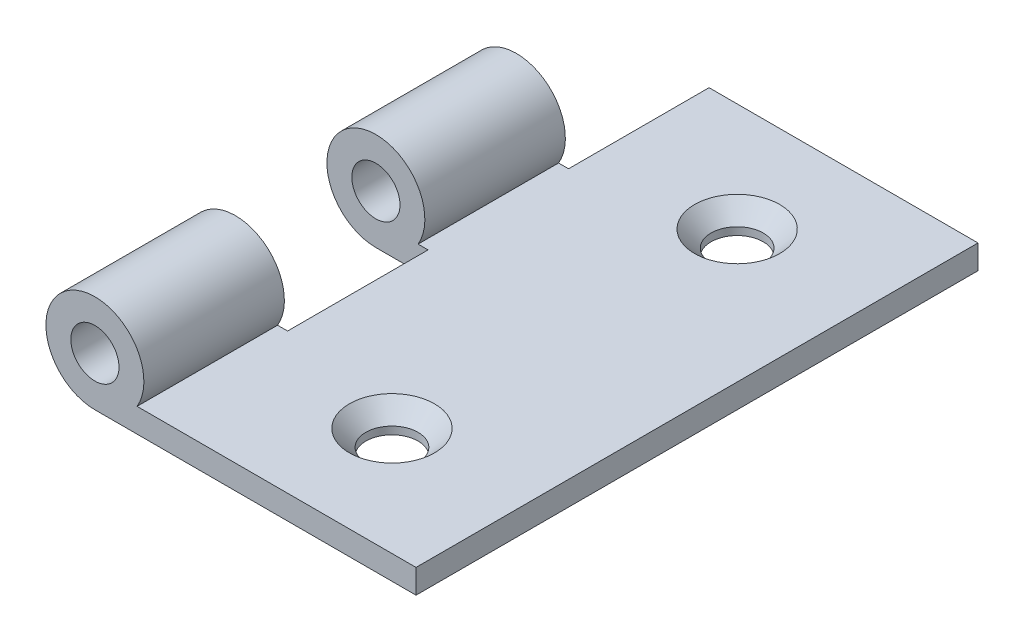
ISO-10303-21;
HEADER;
FILE_DESCRIPTION(('STEP AP214'),'2;1');
FILE_NAME('part.step','',(''),(''),'','','');
FILE_SCHEMA(('AUTOMOTIVE_DESIGN { 1 0 10303 214 1 1 1 1 }'));
ENDSEC;
DATA;
#1=APPLICATION_CONTEXT('core data for automotive mechanical design processes');
#2=APPLICATION_PROTOCOL_DEFINITION('international standard','automotive_design',2000,#1);
#3=PRODUCT_CONTEXT('',#1,'mechanical');
#4=PRODUCT('Part','Part','',(#3));
#5=PRODUCT_RELATED_PRODUCT_CATEGORY('part','',(#4));
#6=PRODUCT_DEFINITION_FORMATION('','',#4);
#7=PRODUCT_DEFINITION_CONTEXT('part definition',#1,'design');
#8=PRODUCT_DEFINITION('design','',#6,#7);
#9=PRODUCT_DEFINITION_SHAPE('','',#8);
#10=(LENGTH_UNIT() NAMED_UNIT(*) SI_UNIT(.MILLI.,.METRE.));
#11=(NAMED_UNIT(*) PLANE_ANGLE_UNIT() SI_UNIT($,.RADIAN.));
#12=(NAMED_UNIT(*) SI_UNIT($,.STERADIAN.) SOLID_ANGLE_UNIT());
#13=UNCERTAINTY_MEASURE_WITH_UNIT(LENGTH_MEASURE(1.E-05),#10,'distance_accuracy_value','');
#14=(GEOMETRIC_REPRESENTATION_CONTEXT(3) GLOBAL_UNCERTAINTY_ASSIGNED_CONTEXT((#13)) GLOBAL_UNIT_ASSIGNED_CONTEXT((#10,
#11,#12)) REPRESENTATION_CONTEXT('',''));
#15=CARTESIAN_POINT('',(0.,0.,0.));
#16=DIRECTION('',(0.,0.,1.));
#17=DIRECTION('',(1.,0.,0.));
#18=AXIS2_PLACEMENT_3D('',#15,#16,#17);
#19=CARTESIAN_POINT('',(40.,-3.1,70.));
#20=DIRECTION('',(0.,-1.,0.));
#21=DIRECTION('',(0.,0.,-1.));
#22=AXIS2_PLACEMENT_3D('',#19,#20,#21);
#23=PLANE('',#22);
#24=CARTESIAN_POINT('',(23.5,-3.1,13.5));
#25=DIRECTION('',(0.,-1.,0.));
#26=DIRECTION('',(0.,0.,-1.));
#27=AXIS2_PLACEMENT_3D('',#24,#25,#26);
#28=CIRCLE('',#27,5.3);
#29=CARTESIAN_POINT('',(23.5,-3.1,8.2));
#30=VERTEX_POINT('',#29);
#31=EDGE_CURVE('E11',#30,#30,#28,.T.);
#32=ORIENTED_EDGE('',*,*,#31,.T.);
#33=EDGE_LOOP('',(#32));
#34=FACE_BOUND('',#33,.T.);
#35=CARTESIAN_POINT('',(23.5,-3.1,56.5));
#36=DIRECTION('',(0.,-1.,0.));
#37=DIRECTION('',(0.,0.,-1.));
#38=AXIS2_PLACEMENT_3D('',#35,#36,#37);
#39=CIRCLE('',#38,5.3);
#40=CARTESIAN_POINT('',(23.5,-3.1,51.2));
#41=VERTEX_POINT('',#40);
#42=EDGE_CURVE('E28',#41,#41,#39,.T.);
#43=ORIENTED_EDGE('',*,*,#42,.T.);
#44=EDGE_LOOP('',(#43));
#45=FACE_BOUND('',#44,.T.);
#46=DIRECTION('',(1.,0.,0.));
#47=VECTOR('',#46,1.);
#48=CARTESIAN_POINT('',(40.,-3.1,52.5));
#49=LINE('',#48,#47);
#50=CARTESIAN_POINT('',(5.25357021462548,-3.1,52.5));
#51=VERTEX_POINT('',#50);
#52=CARTESIAN_POINT('',(6.5,-3.1,52.5));
#53=VERTEX_POINT('',#52);
#54=EDGE_CURVE('E119',#51,#53,#49,.T.);
#55=ORIENTED_EDGE('',*,*,#54,.F.);
#56=DIRECTION('',(0.,0.,-1.));
#57=VECTOR('',#56,1.);
#58=CARTESIAN_POINT('',(5.25357021462548,-3.1,70.));
#59=LINE('',#58,#57);
#60=CARTESIAN_POINT('',(5.25357021462548,-3.1,70.));
#61=VERTEX_POINT('',#60);
#62=EDGE_CURVE('E227',#61,#51,#59,.T.);
#63=ORIENTED_EDGE('',*,*,#62,.F.);
#64=DIRECTION('',(-1.,0.,0.));
#65=VECTOR('',#64,1.);
#66=CARTESIAN_POINT('',(40.,-3.1,70.));
#67=LINE('',#66,#65);
#68=CARTESIAN_POINT('',(40.,-3.1,70.));
#69=VERTEX_POINT('',#68);
#70=EDGE_CURVE('E174',#69,#61,#67,.T.);
#71=ORIENTED_EDGE('',*,*,#70,.F.);
#72=DIRECTION('',(0.,0.,-1.));
#73=VECTOR('',#72,1.);
#74=CARTESIAN_POINT('',(40.,-3.1,70.));
#75=LINE('',#74,#73);
#76=CARTESIAN_POINT('',(40.,-3.1,0.));
#77=VERTEX_POINT('',#76);
#78=EDGE_CURVE('E263',#69,#77,#75,.T.);
#79=ORIENTED_EDGE('',*,*,#78,.T.);
#80=DIRECTION('',(-1.,0.,0.));
#81=VECTOR('',#80,1.);
#82=CARTESIAN_POINT('',(40.,-3.1,0.));
#83=LINE('',#82,#81);
#84=CARTESIAN_POINT('',(6.5,-3.1,0.));
#85=VERTEX_POINT('',#84);
#86=EDGE_CURVE('E229',#77,#85,#83,.T.);
#87=ORIENTED_EDGE('',*,*,#86,.T.);
#88=DIRECTION('',(0.,0.,-1.));
#89=VECTOR('',#88,1.);
#90=CARTESIAN_POINT('',(6.5,-3.1,70.));
#91=LINE('',#90,#89);
#92=CARTESIAN_POINT('',(6.5,-3.1,17.5));
#93=VERTEX_POINT('',#92);
#94=EDGE_CURVE('E199',#93,#85,#91,.T.);
#95=ORIENTED_EDGE('',*,*,#94,.F.);
#96=DIRECTION('',(1.,0.,0.));
#97=VECTOR('',#96,1.);
#98=CARTESIAN_POINT('',(40.,-3.1,17.5));
#99=LINE('',#98,#97);
#100=CARTESIAN_POINT('',(5.25357021462548,-3.1,17.5));
#101=VERTEX_POINT('',#100);
#102=EDGE_CURVE('E205',#101,#93,#99,.T.);
#103=ORIENTED_EDGE('',*,*,#102,.F.);
#104=DIRECTION('',(0.,0.,-1.));
#105=VECTOR('',#104,1.);
#106=CARTESIAN_POINT('',(5.25357021462548,-3.1,70.));
#107=LINE('',#106,#105);
#108=CARTESIAN_POINT('',(5.25357021462548,-3.1,35.));
#109=VERTEX_POINT('',#108);
#110=EDGE_CURVE('E230',#109,#101,#107,.T.);
#111=ORIENTED_EDGE('',*,*,#110,.F.);
#112=DIRECTION('',(-1.,0.,0.));
#113=VECTOR('',#112,1.);
#114=CARTESIAN_POINT('',(40.,-3.1,35.));
#115=LINE('',#114,#113);
#116=CARTESIAN_POINT('',(6.5,-3.1,35.));
#117=VERTEX_POINT('',#116);
#118=EDGE_CURVE('E130',#117,#109,#115,.T.);
#119=ORIENTED_EDGE('',*,*,#118,.F.);
#120=DIRECTION('',(0.,0.,-1.));
#121=VECTOR('',#120,1.);
#122=CARTESIAN_POINT('',(6.5,-3.1,70.));
#123=LINE('',#122,#121);
#124=EDGE_CURVE('E242',#53,#117,#123,.T.);
#125=ORIENTED_EDGE('',*,*,#124,.F.);
#126=EDGE_LOOP('',(#55,#63,#71,#79,#87,#95,#103,#111,#119,#125));
#127=FACE_BOUND('',#126,.T.);
#128=ADVANCED_FACE('F17',(#34,#45,#127),#23,.F.);
#129=CARTESIAN_POINT('',(0.,0.,70.));
#130=DIRECTION('',(0.,0.,-1.));
#131=DIRECTION('',(-1.,0.,0.));
#132=AXIS2_PLACEMENT_3D('',#129,#130,#131);
#133=CYLINDRICAL_SURFACE('',#132,6.1);
#134=CARTESIAN_POINT('',(0.,0.,52.5));
#135=DIRECTION('',(0.,0.,-1.));
#136=DIRECTION('',(-1.,0.,0.));
#137=AXIS2_PLACEMENT_3D('',#134,#135,#136);
#138=CIRCLE('',#137,6.1);
#139=CARTESIAN_POINT('',(0.,-6.1,52.5));
#140=VERTEX_POINT('',#139);
#141=EDGE_CURVE('E182',#140,#51,#138,.T.);
#142=ORIENTED_EDGE('',*,*,#141,.F.);
#143=DIRECTION('',(0.,0.,-1.));
#144=VECTOR('',#143,1.);
#145=CARTESIAN_POINT('',(0.,-6.1,70.));
#146=LINE('',#145,#144);
#147=CARTESIAN_POINT('',(0.,-6.1,70.));
#148=VERTEX_POINT('',#147);
#149=EDGE_CURVE('E181',#148,#140,#146,.T.);
#150=ORIENTED_EDGE('',*,*,#149,.F.);
#151=CARTESIAN_POINT('',(0.,0.,70.));
#152=DIRECTION('',(0.,0.,1.));
#153=DIRECTION('',(1.,0.,0.));
#154=AXIS2_PLACEMENT_3D('',#151,#152,#153);
#155=CIRCLE('',#154,6.1);
#156=EDGE_CURVE('E166',#61,#148,#155,.T.);
#157=ORIENTED_EDGE('',*,*,#156,.F.);
#158=ORIENTED_EDGE('',*,*,#62,.T.);
#159=EDGE_LOOP('',(#142,#150,#157,#158));
#160=FACE_BOUND('',#159,.T.);
#161=ADVANCED_FACE('F19',(#160),#133,.T.);
#162=CARTESIAN_POINT('',(0.,0.,70.));
#163=DIRECTION('',(0.,0.,-1.));
#164=DIRECTION('',(-1.,0.,0.));
#165=AXIS2_PLACEMENT_3D('',#162,#163,#164);
#166=CYLINDRICAL_SURFACE('',#165,6.1);
#167=CARTESIAN_POINT('',(0.,0.,35.));
#168=DIRECTION('',(0.,0.,1.));
#169=DIRECTION('',(1.,0.,0.));
#170=AXIS2_PLACEMENT_3D('',#167,#168,#169);
#171=CIRCLE('',#170,6.1);
#172=CARTESIAN_POINT('',(0.,-6.1,35.));
#173=VERTEX_POINT('',#172);
#174=EDGE_CURVE('E277',#109,#173,#171,.T.);
#175=ORIENTED_EDGE('',*,*,#174,.F.);
#176=ORIENTED_EDGE('',*,*,#110,.T.);
#177=CARTESIAN_POINT('',(0.,0.,17.5));
#178=DIRECTION('',(0.,0.,-1.));
#179=DIRECTION('',(-1.,0.,0.));
#180=AXIS2_PLACEMENT_3D('',#177,#178,#179);
#181=CIRCLE('',#180,6.1);
#182=CARTESIAN_POINT('',(0.,-6.1,17.5));
#183=VERTEX_POINT('',#182);
#184=EDGE_CURVE('E292',#183,#101,#181,.T.);
#185=ORIENTED_EDGE('',*,*,#184,.F.);
#186=DIRECTION('',(0.,0.,-1.));
#187=VECTOR('',#186,1.);
#188=CARTESIAN_POINT('',(0.,-6.1,70.));
#189=LINE('',#188,#187);
#190=EDGE_CURVE('E266',#173,#183,#189,.T.);
#191=ORIENTED_EDGE('',*,*,#190,.F.);
#192=EDGE_LOOP('',(#175,#176,#185,#191));
#193=FACE_BOUND('',#192,.T.);
#194=ADVANCED_FACE('F355',(#193),#166,.T.);
#195=CARTESIAN_POINT('',(0.,-6.1,70.));
#196=DIRECTION('',(0.,1.,0.));
#197=DIRECTION('',(1.,0.,0.));
#198=AXIS2_PLACEMENT_3D('',#195,#196,#197);
#199=PLANE('',#198);
#200=CARTESIAN_POINT('',(23.5,-6.1,13.5));
#201=DIRECTION('',(0.,-1.,0.));
#202=DIRECTION('',(0.,0.,-1.));
#203=AXIS2_PLACEMENT_3D('',#200,#201,#202);
#204=CIRCLE('',#203,3.25);
#205=CARTESIAN_POINT('',(23.5,-6.1,10.25));
#206=VERTEX_POINT('',#205);
#207=EDGE_CURVE('E211',#206,#206,#204,.T.);
#208=ORIENTED_EDGE('',*,*,#207,.F.);
#209=EDGE_LOOP('',(#208));
#210=FACE_BOUND('',#209,.T.);
#211=CARTESIAN_POINT('',(23.5,-6.1,56.5));
#212=DIRECTION('',(0.,-1.,0.));
#213=DIRECTION('',(0.,0.,-1.));
#214=AXIS2_PLACEMENT_3D('',#211,#212,#213);
#215=CIRCLE('',#214,3.25);
#216=CARTESIAN_POINT('',(23.5,-6.1,53.25));
#217=VERTEX_POINT('',#216);
#218=EDGE_CURVE('E210',#217,#217,#215,.T.);
#219=ORIENTED_EDGE('',*,*,#218,.F.);
#220=EDGE_LOOP('',(#219));
#221=FACE_BOUND('',#220,.T.);
#222=DIRECTION('',(-1.,0.,0.));
#223=VECTOR('',#222,1.);
#224=CARTESIAN_POINT('',(0.,-6.1,52.5));
#225=LINE('',#224,#223);
#226=CARTESIAN_POINT('',(6.5,-6.1,52.5));
#227=VERTEX_POINT('',#226);
#228=EDGE_CURVE('E256',#227,#140,#225,.T.);
#229=ORIENTED_EDGE('',*,*,#228,.F.);
#230=DIRECTION('',(0.,0.,1.));
#231=VECTOR('',#230,1.);
#232=CARTESIAN_POINT('',(6.5,-6.1,70.));
#233=LINE('',#232,#231);
#234=CARTESIAN_POINT('',(6.5,-6.1,35.));
#235=VERTEX_POINT('',#234);
#236=EDGE_CURVE('E243',#235,#227,#233,.T.);
#237=ORIENTED_EDGE('',*,*,#236,.F.);
#238=DIRECTION('',(1.,0.,0.));
#239=VECTOR('',#238,1.);
#240=CARTESIAN_POINT('',(0.,-6.1,35.));
#241=LINE('',#240,#239);
#242=EDGE_CURVE('E288',#173,#235,#241,.T.);
#243=ORIENTED_EDGE('',*,*,#242,.F.);
#244=ORIENTED_EDGE('',*,*,#190,.T.);
#245=DIRECTION('',(-1.,0.,0.));
#246=VECTOR('',#245,1.);
#247=CARTESIAN_POINT('',(0.,-6.1,17.5));
#248=LINE('',#247,#246);
#249=CARTESIAN_POINT('',(6.5,-6.1,17.5));
#250=VERTEX_POINT('',#249);
#251=EDGE_CURVE('E206',#250,#183,#248,.T.);
#252=ORIENTED_EDGE('',*,*,#251,.F.);
#253=DIRECTION('',(0.,0.,1.));
#254=VECTOR('',#253,1.);
#255=CARTESIAN_POINT('',(6.5,-6.1,70.));
#256=LINE('',#255,#254);
#257=CARTESIAN_POINT('',(6.5,-6.1,0.));
#258=VERTEX_POINT('',#257);
#259=EDGE_CURVE('E259',#258,#250,#256,.T.);
#260=ORIENTED_EDGE('',*,*,#259,.F.);
#261=DIRECTION('',(1.,0.,0.));
#262=VECTOR('',#261,1.);
#263=CARTESIAN_POINT('',(0.,-6.1,0.));
#264=LINE('',#263,#262);
#265=CARTESIAN_POINT('',(40.,-6.1,0.));
#266=VERTEX_POINT('',#265);
#267=EDGE_CURVE('E186',#258,#266,#264,.T.);
#268=ORIENTED_EDGE('',*,*,#267,.T.);
#269=DIRECTION('',(0.,0.,-1.));
#270=VECTOR('',#269,1.);
#271=CARTESIAN_POINT('',(40.,-6.1,70.));
#272=LINE('',#271,#270);
#273=CARTESIAN_POINT('',(40.,-6.1,70.));
#274=VERTEX_POINT('',#273);
#275=EDGE_CURVE('E191',#274,#266,#272,.T.);
#276=ORIENTED_EDGE('',*,*,#275,.F.);
#277=DIRECTION('',(1.,0.,0.));
#278=VECTOR('',#277,1.);
#279=CARTESIAN_POINT('',(0.,-6.1,70.));
#280=LINE('',#279,#278);
#281=EDGE_CURVE('E171',#148,#274,#280,.T.);
#282=ORIENTED_EDGE('',*,*,#281,.F.);
#283=ORIENTED_EDGE('',*,*,#149,.T.);
#284=EDGE_LOOP('',(#229,#237,#243,#244,#252,#260,#268,#276,#282,#283));
#285=FACE_BOUND('',#284,.T.);
#286=ADVANCED_FACE('F189',(#210,#221,#285),#199,.F.);
#287=CARTESIAN_POINT('',(0.,0.,70.));
#288=DIRECTION('',(0.,0.,-1.));
#289=DIRECTION('',(-1.,0.,0.));
#290=AXIS2_PLACEMENT_3D('',#287,#288,#289);
#291=CYLINDRICAL_SURFACE('',#290,3.);
#292=CARTESIAN_POINT('',(0.,0.,70.));
#293=DIRECTION('',(0.,0.,1.));
#294=DIRECTION('',(1.,0.,0.));
#295=AXIS2_PLACEMENT_3D('',#292,#293,#294);
#296=CIRCLE('',#295,3.);
#297=CARTESIAN_POINT('',(3.,0.,70.));
#298=VERTEX_POINT('',#297);
#299=EDGE_CURVE('E187',#298,#298,#296,.T.);
#300=ORIENTED_EDGE('',*,*,#299,.T.);
#301=EDGE_LOOP('',(#300));
#302=FACE_BOUND('',#301,.T.);
#303=CARTESIAN_POINT('',(0.,0.,52.5));
#304=DIRECTION('',(0.,0.,-1.));
#305=DIRECTION('',(-1.,0.,0.));
#306=AXIS2_PLACEMENT_3D('',#303,#304,#305);
#307=CIRCLE('',#306,3.);
#308=CARTESIAN_POINT('',(-3.,0.,52.5));
#309=VERTEX_POINT('',#308);
#310=EDGE_CURVE('E231',#309,#309,#307,.T.);
#311=ORIENTED_EDGE('',*,*,#310,.T.);
#312=EDGE_LOOP('',(#311));
#313=FACE_BOUND('',#312,.T.);
#314=ADVANCED_FACE('F337',(#302,#313),#291,.F.);
#315=CARTESIAN_POINT('',(0.,0.,0.));
#316=DIRECTION('',(0.,0.,1.));
#317=DIRECTION('',(1.,0.,0.));
#318=AXIS2_PLACEMENT_3D('',#315,#316,#317);
#319=PLANE('',#318);
#320=DIRECTION('',(0.,-1.,0.));
#321=VECTOR('',#320,1.);
#322=CARTESIAN_POINT('',(6.5,0.,0.));
#323=LINE('',#322,#321);
#324=EDGE_CURVE('E249',#85,#258,#323,.T.);
#325=ORIENTED_EDGE('',*,*,#324,.F.);
#326=ORIENTED_EDGE('',*,*,#86,.F.);
#327=DIRECTION('',(0.,1.,0.));
#328=VECTOR('',#327,1.);
#329=CARTESIAN_POINT('',(40.,-6.1,0.));
#330=LINE('',#329,#328);
#331=EDGE_CURVE('E235',#266,#77,#330,.T.);
#332=ORIENTED_EDGE('',*,*,#331,.F.);
#333=ORIENTED_EDGE('',*,*,#267,.F.);
#334=EDGE_LOOP('',(#325,#326,#332,#333));
#335=FACE_BOUND('',#334,.T.);
#336=ADVANCED_FACE('F335',(#335),#319,.F.);
#337=CARTESIAN_POINT('',(40.,-6.1,70.));
#338=DIRECTION('',(-1.,0.,0.));
#339=DIRECTION('',(0.,0.,1.));
#340=AXIS2_PLACEMENT_3D('',#337,#338,#339);
#341=PLANE('',#340);
#342=ORIENTED_EDGE('',*,*,#331,.T.);
#343=ORIENTED_EDGE('',*,*,#78,.F.);
#344=DIRECTION('',(0.,1.,0.));
#345=VECTOR('',#344,1.);
#346=CARTESIAN_POINT('',(40.,-6.1,70.));
#347=LINE('',#346,#345);
#348=EDGE_CURVE('E194',#274,#69,#347,.T.);
#349=ORIENTED_EDGE('',*,*,#348,.F.);
#350=ORIENTED_EDGE('',*,*,#275,.T.);
#351=EDGE_LOOP('',(#342,#343,#349,#350));
#352=FACE_BOUND('',#351,.T.);
#353=ADVANCED_FACE('F334',(#352),#341,.F.);
#354=CARTESIAN_POINT('',(0.,0.,70.));
#355=DIRECTION('',(0.,0.,1.));
#356=DIRECTION('',(1.,0.,0.));
#357=AXIS2_PLACEMENT_3D('',#354,#355,#356);
#358=PLANE('',#357);
#359=ORIENTED_EDGE('',*,*,#299,.F.);
#360=EDGE_LOOP('',(#359));
#361=FACE_BOUND('',#360,.T.);
#362=ORIENTED_EDGE('',*,*,#70,.T.);
#363=ORIENTED_EDGE('',*,*,#156,.T.);
#364=ORIENTED_EDGE('',*,*,#281,.T.);
#365=ORIENTED_EDGE('',*,*,#348,.T.);
#366=EDGE_LOOP('',(#362,#363,#364,#365));
#367=FACE_BOUND('',#366,.T.);
#368=ADVANCED_FACE('F168',(#361,#367),#358,.T.);
#369=CARTESIAN_POINT('',(6.5,12.,17.5));
#370=DIRECTION('',(-1.,0.,0.));
#371=DIRECTION('',(0.,0.,1.));
#372=AXIS2_PLACEMENT_3D('',#369,#370,#371);
#373=PLANE('',#372);
#374=ORIENTED_EDGE('',*,*,#94,.T.);
#375=ORIENTED_EDGE('',*,*,#324,.T.);
#376=ORIENTED_EDGE('',*,*,#259,.T.);
#377=DIRECTION('',(0.,-1.,0.));
#378=VECTOR('',#377,1.);
#379=CARTESIAN_POINT('',(6.5,12.,17.5));
#380=LINE('',#379,#378);
#381=EDGE_CURVE('E203',#93,#250,#380,.T.);
#382=ORIENTED_EDGE('',*,*,#381,.F.);
#383=EDGE_LOOP('',(#374,#375,#376,#382));
#384=FACE_BOUND('',#383,.T.);
#385=ADVANCED_FACE('F306',(#384),#373,.T.);
#386=CARTESIAN_POINT('',(-10.,12.,17.5));
#387=DIRECTION('',(0.,0.,-1.));
#388=DIRECTION('',(0.,-1.,0.));
#389=AXIS2_PLACEMENT_3D('',#386,#387,#388);
#390=PLANE('',#389);
#391=CARTESIAN_POINT('',(0.,0.,17.5));
#392=DIRECTION('',(0.,0.,-1.));
#393=DIRECTION('',(-1.,0.,0.));
#394=AXIS2_PLACEMENT_3D('',#391,#392,#393);
#395=CIRCLE('',#394,3.);
#396=CARTESIAN_POINT('',(-3.,0.,17.5));
#397=VERTEX_POINT('',#396);
#398=EDGE_CURVE('E21',#397,#397,#395,.T.);
#399=ORIENTED_EDGE('',*,*,#398,.F.);
#400=EDGE_LOOP('',(#399));
#401=FACE_BOUND('',#400,.T.);
#402=ORIENTED_EDGE('',*,*,#102,.T.);
#403=ORIENTED_EDGE('',*,*,#381,.T.);
#404=ORIENTED_EDGE('',*,*,#251,.T.);
#405=ORIENTED_EDGE('',*,*,#184,.T.);
#406=EDGE_LOOP('',(#402,#403,#404,#405));
#407=FACE_BOUND('',#406,.T.);
#408=ADVANCED_FACE('F299',(#401,#407),#390,.T.);
#409=CARTESIAN_POINT('',(0.,0.,70.));
#410=DIRECTION('',(0.,0.,-1.));
#411=DIRECTION('',(-1.,0.,0.));
#412=AXIS2_PLACEMENT_3D('',#409,#410,#411);
#413=CYLINDRICAL_SURFACE('',#412,3.);
#414=ORIENTED_EDGE('',*,*,#398,.T.);
#415=EDGE_LOOP('',(#414));
#416=FACE_BOUND('',#415,.T.);
#417=CARTESIAN_POINT('',(0.,0.,35.));
#418=DIRECTION('',(0.,0.,1.));
#419=DIRECTION('',(1.,0.,0.));
#420=AXIS2_PLACEMENT_3D('',#417,#418,#419);
#421=CIRCLE('',#420,3.);
#422=CARTESIAN_POINT('',(3.,0.,35.));
#423=VERTEX_POINT('',#422);
#424=EDGE_CURVE('E100',#423,#423,#421,.T.);
#425=ORIENTED_EDGE('',*,*,#424,.T.);
#426=EDGE_LOOP('',(#425));
#427=FACE_BOUND('',#426,.T.);
#428=ADVANCED_FACE('F369',(#416,#427),#413,.F.);
#429=CARTESIAN_POINT('',(6.5,12.,52.5));
#430=DIRECTION('',(-1.,0.,0.));
#431=DIRECTION('',(0.,0.,1.));
#432=AXIS2_PLACEMENT_3D('',#429,#430,#431);
#433=PLANE('',#432);
#434=ORIENTED_EDGE('',*,*,#124,.T.);
#435=DIRECTION('',(0.,-1.,0.));
#436=VECTOR('',#435,1.);
#437=CARTESIAN_POINT('',(6.5,12.,35.));
#438=LINE('',#437,#436);
#439=EDGE_CURVE('E238',#117,#235,#438,.T.);
#440=ORIENTED_EDGE('',*,*,#439,.T.);
#441=ORIENTED_EDGE('',*,*,#236,.T.);
#442=DIRECTION('',(0.,-1.,0.));
#443=VECTOR('',#442,1.);
#444=CARTESIAN_POINT('',(6.5,12.,52.5));
#445=LINE('',#444,#443);
#446=EDGE_CURVE('E253',#53,#227,#445,.T.);
#447=ORIENTED_EDGE('',*,*,#446,.F.);
#448=EDGE_LOOP('',(#434,#440,#441,#447));
#449=FACE_BOUND('',#448,.T.);
#450=ADVANCED_FACE('F367',(#449),#433,.T.);
#451=CARTESIAN_POINT('',(-20.,12.,52.5));
#452=DIRECTION('',(0.,0.,-1.));
#453=DIRECTION('',(0.,-1.,0.));
#454=AXIS2_PLACEMENT_3D('',#451,#452,#453);
#455=PLANE('',#454);
#456=ORIENTED_EDGE('',*,*,#310,.F.);
#457=EDGE_LOOP('',(#456));
#458=FACE_BOUND('',#457,.T.);
#459=ORIENTED_EDGE('',*,*,#54,.T.);
#460=ORIENTED_EDGE('',*,*,#446,.T.);
#461=ORIENTED_EDGE('',*,*,#228,.T.);
#462=ORIENTED_EDGE('',*,*,#141,.T.);
#463=EDGE_LOOP('',(#459,#460,#461,#462));
#464=FACE_BOUND('',#463,.T.);
#465=ADVANCED_FACE('F363',(#458,#464),#455,.T.);
#466=CARTESIAN_POINT('',(6.5,12.,35.));
#467=DIRECTION('',(0.,0.,1.));
#468=DIRECTION('',(1.,0.,0.));
#469=AXIS2_PLACEMENT_3D('',#466,#467,#468);
#470=PLANE('',#469);
#471=ORIENTED_EDGE('',*,*,#424,.F.);
#472=EDGE_LOOP('',(#471));
#473=FACE_BOUND('',#472,.T.);
#474=ORIENTED_EDGE('',*,*,#118,.T.);
#475=ORIENTED_EDGE('',*,*,#174,.T.);
#476=ORIENTED_EDGE('',*,*,#242,.T.);
#477=ORIENTED_EDGE('',*,*,#439,.F.);
#478=EDGE_LOOP('',(#474,#475,#476,#477));
#479=FACE_BOUND('',#478,.T.);
#480=ADVANCED_FACE('F366',(#473,#479),#470,.T.);
#481=CARTESIAN_POINT('',(23.5,-3.1,56.5));
#482=DIRECTION('',(0.,1.,0.));
#483=DIRECTION('',(0.,0.,1.));
#484=AXIS2_PLACEMENT_3D('',#481,#482,#483);
#485=CONICAL_SURFACE('',#484,5.3,0.785398163397449);
#486=CARTESIAN_POINT('',(23.5,-5.15,56.5));
#487=DIRECTION('',(0.,-1.,0.));
#488=DIRECTION('',(0.,0.,-1.));
#489=AXIS2_PLACEMENT_3D('',#486,#487,#488);
#490=CIRCLE('',#489,3.25);
#491=CARTESIAN_POINT('',(23.5,-5.15,53.25));
#492=VERTEX_POINT('',#491);
#493=EDGE_CURVE('E217',#492,#492,#490,.T.);
#494=ORIENTED_EDGE('',*,*,#493,.T.);
#495=EDGE_LOOP('',(#494));
#496=FACE_BOUND('',#495,.T.);
#497=ORIENTED_EDGE('',*,*,#42,.F.);
#498=EDGE_LOOP('',(#497));
#499=FACE_BOUND('',#498,.T.);
#500=ADVANCED_FACE('F373',(#496,#499),#485,.F.);
#501=CARTESIAN_POINT('',(23.5,-6.1,56.5));
#502=DIRECTION('',(0.,-1.,0.));
#503=DIRECTION('',(0.,0.,-1.));
#504=AXIS2_PLACEMENT_3D('',#501,#502,#503);
#505=CYLINDRICAL_SURFACE('',#504,3.25);
#506=ORIENTED_EDGE('',*,*,#218,.T.);
#507=EDGE_LOOP('',(#506));
#508=FACE_BOUND('',#507,.T.);
#509=ORIENTED_EDGE('',*,*,#493,.F.);
#510=EDGE_LOOP('',(#509));
#511=FACE_BOUND('',#510,.T.);
#512=ADVANCED_FACE('F376',(#508,#511),#505,.F.);
#513=CARTESIAN_POINT('',(23.5,-3.1,13.5));
#514=DIRECTION('',(0.,1.,0.));
#515=DIRECTION('',(0.,0.,1.));
#516=AXIS2_PLACEMENT_3D('',#513,#514,#515);
#517=CONICAL_SURFACE('',#516,5.3,0.785398163397449);
#518=CARTESIAN_POINT('',(23.5,-5.15,13.5));
#519=DIRECTION('',(0.,-1.,0.));
#520=DIRECTION('',(0.,0.,-1.));
#521=AXIS2_PLACEMENT_3D('',#518,#519,#520);
#522=CIRCLE('',#521,3.25);
#523=CARTESIAN_POINT('',(23.5,-5.15,10.25));
#524=VERTEX_POINT('',#523);
#525=EDGE_CURVE('E207',#524,#524,#522,.T.);
#526=ORIENTED_EDGE('',*,*,#525,.T.);
#527=EDGE_LOOP('',(#526));
#528=FACE_BOUND('',#527,.T.);
#529=ORIENTED_EDGE('',*,*,#31,.F.);
#530=EDGE_LOOP('',(#529));
#531=FACE_BOUND('',#530,.T.);
#532=ADVANCED_FACE('F380',(#528,#531),#517,.F.);
#533=CARTESIAN_POINT('',(23.5,-6.1,13.5));
#534=DIRECTION('',(0.,-1.,0.));
#535=DIRECTION('',(0.,0.,-1.));
#536=AXIS2_PLACEMENT_3D('',#533,#534,#535);
#537=CYLINDRICAL_SURFACE('',#536,3.25);
#538=ORIENTED_EDGE('',*,*,#207,.T.);
#539=EDGE_LOOP('',(#538));
#540=FACE_BOUND('',#539,.T.);
#541=ORIENTED_EDGE('',*,*,#525,.F.);
#542=EDGE_LOOP('',(#541));
#543=FACE_BOUND('',#542,.T.);
#544=ADVANCED_FACE('F397',(#540,#543),#537,.F.);
#545=CLOSED_SHELL('',(#128,#161,#194,#286,#314,#336,#353,#368,#385,#408,#428,#450,#465,#480,
#500,#512,#532,#544));
#546=MANIFOLD_SOLID_BREP('B1',#545);
#547=ADVANCED_BREP_SHAPE_REPRESENTATION('',(#18,#546),#14);
#548=SHAPE_DEFINITION_REPRESENTATION(#9,#547);
ENDSEC;
END-ISO-10303-21;
